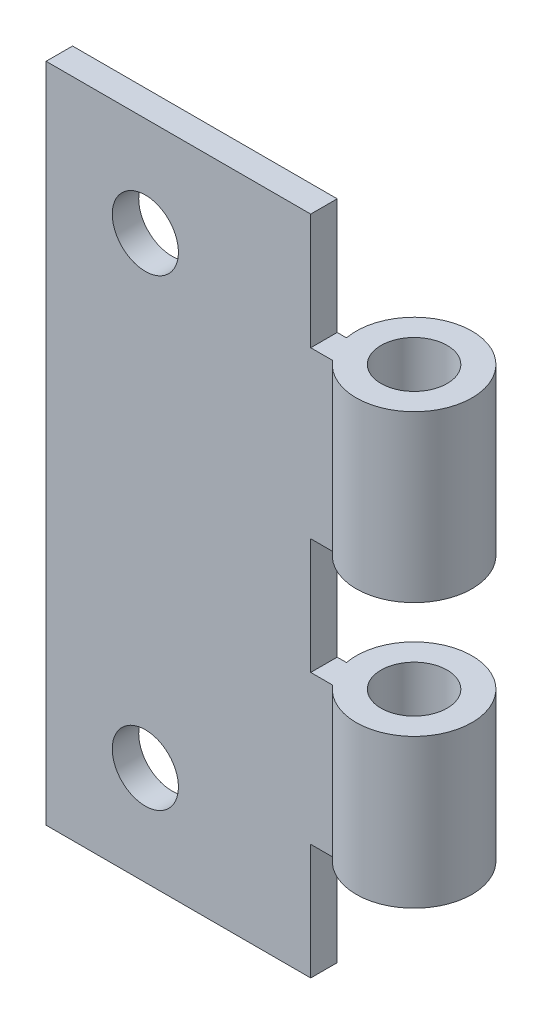
ISO-10303-21;
HEADER;
FILE_DESCRIPTION(('STEP AP214'),'2;1');
FILE_NAME('part.step','',(''),(''),'','','');
FILE_SCHEMA(('AUTOMOTIVE_DESIGN { 1 0 10303 214 1 1 1 1 }'));
ENDSEC;
DATA;
#1=APPLICATION_CONTEXT('core data for automotive mechanical design processes');
#2=APPLICATION_PROTOCOL_DEFINITION('international standard','automotive_design',2000,#1);
#3=PRODUCT_CONTEXT('',#1,'mechanical');
#4=PRODUCT('Part','Part','',(#3));
#5=PRODUCT_RELATED_PRODUCT_CATEGORY('part','',(#4));
#6=PRODUCT_DEFINITION_FORMATION('','',#4);
#7=PRODUCT_DEFINITION_CONTEXT('part definition',#1,'design');
#8=PRODUCT_DEFINITION('design','',#6,#7);
#9=PRODUCT_DEFINITION_SHAPE('','',#8);
#10=(LENGTH_UNIT() NAMED_UNIT(*) SI_UNIT(.MILLI.,.METRE.));
#11=(NAMED_UNIT(*) PLANE_ANGLE_UNIT() SI_UNIT($,.RADIAN.));
#12=(NAMED_UNIT(*) SI_UNIT($,.STERADIAN.) SOLID_ANGLE_UNIT());
#13=UNCERTAINTY_MEASURE_WITH_UNIT(LENGTH_MEASURE(1.E-05),#10,'distance_accuracy_value','');
#14=(GEOMETRIC_REPRESENTATION_CONTEXT(3) GLOBAL_UNCERTAINTY_ASSIGNED_CONTEXT((#13)) GLOBAL_UNIT_ASSIGNED_CONTEXT((#10,
#11,#12)) REPRESENTATION_CONTEXT('',''));
#15=CARTESIAN_POINT('',(0.,0.,0.));
#16=DIRECTION('',(0.,0.,1.));
#17=DIRECTION('',(1.,0.,0.));
#18=AXIS2_PLACEMENT_3D('',#15,#16,#17);
#19=CARTESIAN_POINT('',(-9.0853298966291,50.8,0.));
#20=DIRECTION('',(0.,0.,-1.));
#21=DIRECTION('',(-1.,0.,0.));
#22=AXIS2_PLACEMENT_3D('',#19,#20,#21);
#23=PLANE('',#22);
#24=CARTESIAN_POINT('',(7.62,43.18,0.));
#25=DIRECTION('',(0.,0.,-1.));
#26=DIRECTION('',(-1.,0.,0.));
#27=AXIS2_PLACEMENT_3D('',#24,#25,#26);
#28=CIRCLE('',#27,2.54000000000001);
#29=CARTESIAN_POINT('',(5.07999999999999,43.18,0.));
#30=VERTEX_POINT('',#29);
#31=EDGE_CURVE('E224',#30,#30,#28,.T.);
#32=ORIENTED_EDGE('',*,*,#31,.T.);
#33=EDGE_LOOP('',(#32));
#34=FACE_BOUND('',#33,.T.);
#35=CARTESIAN_POINT('',(7.62,7.62,0.));
#36=DIRECTION('',(0.,0.,-1.));
#37=DIRECTION('',(-1.,0.,0.));
#38=AXIS2_PLACEMENT_3D('',#35,#36,#37);
#39=CIRCLE('',#38,2.54);
#40=CARTESIAN_POINT('',(5.08,7.62,0.));
#41=VERTEX_POINT('',#40);
#42=EDGE_CURVE('E218',#41,#41,#39,.T.);
#43=ORIENTED_EDGE('',*,*,#42,.T.);
#44=EDGE_LOOP('',(#43));
#45=FACE_BOUND('',#44,.T.);
#46=DIRECTION('',(0.,1.,0.));
#47=VECTOR('',#46,1.);
#48=CARTESIAN_POINT('',(20.32,41.91,0.));
#49=LINE('',#48,#47);
#50=CARTESIAN_POINT('',(20.32,41.91,0.));
#51=VERTEX_POINT('',#50);
#52=CARTESIAN_POINT('',(20.32,50.8,0.));
#53=VERTEX_POINT('',#52);
#54=EDGE_CURVE('E161',#51,#53,#49,.T.);
#55=ORIENTED_EDGE('',*,*,#54,.T.);
#56=DIRECTION('',(1.,0.,0.));
#57=VECTOR('',#56,1.);
#58=CARTESIAN_POINT('',(-9.0853298966291,50.8,0.));
#59=LINE('',#58,#57);
#60=CARTESIAN_POINT('',(0.,50.8,0.));
#61=VERTEX_POINT('',#60);
#62=EDGE_CURVE('E228',#61,#53,#59,.T.);
#63=ORIENTED_EDGE('',*,*,#62,.F.);
#64=DIRECTION('',(0.,-1.,0.));
#65=VECTOR('',#64,1.);
#66=CARTESIAN_POINT('',(0.,50.8,0.));
#67=LINE('',#66,#65);
#68=CARTESIAN_POINT('',(0.,0.,0.));
#69=VERTEX_POINT('',#68);
#70=EDGE_CURVE('E236',#61,#69,#67,.T.);
#71=ORIENTED_EDGE('',*,*,#70,.T.);
#72=DIRECTION('',(1.,0.,0.));
#73=VECTOR('',#72,1.);
#74=CARTESIAN_POINT('',(-9.0853298966291,0.,0.));
#75=LINE('',#74,#73);
#76=CARTESIAN_POINT('',(20.32,0.,0.));
#77=VERTEX_POINT('',#76);
#78=EDGE_CURVE('E227',#69,#77,#75,.T.);
#79=ORIENTED_EDGE('',*,*,#78,.T.);
#80=DIRECTION('',(0.,-1.,0.));
#81=VECTOR('',#80,1.);
#82=CARTESIAN_POINT('',(20.32,8.89,0.));
#83=LINE('',#82,#81);
#84=CARTESIAN_POINT('',(20.32,8.89,0.));
#85=VERTEX_POINT('',#84);
#86=EDGE_CURVE('E209',#85,#77,#83,.T.);
#87=ORIENTED_EDGE('',*,*,#86,.F.);
#88=DIRECTION('',(1.,0.,0.));
#89=VECTOR('',#88,1.);
#90=CARTESIAN_POINT('',(-9.0853298966291,8.89,0.));
#91=LINE('',#90,#89);
#92=CARTESIAN_POINT('',(21.9951918189126,8.89,0.));
#93=VERTEX_POINT('',#92);
#94=EDGE_CURVE('E197',#85,#93,#91,.T.);
#95=ORIENTED_EDGE('',*,*,#94,.T.);
#96=DIRECTION('',(0.,-1.,0.));
#97=VECTOR('',#96,1.);
#98=CARTESIAN_POINT('',(21.9951918189126,50.8,0.));
#99=LINE('',#98,#97);
#100=CARTESIAN_POINT('',(21.9951918189126,20.32,0.));
#101=VERTEX_POINT('',#100);
#102=EDGE_CURVE('E41',#101,#93,#99,.T.);
#103=ORIENTED_EDGE('',*,*,#102,.F.);
#104=DIRECTION('',(1.,0.,0.));
#105=VECTOR('',#104,1.);
#106=CARTESIAN_POINT('',(-9.0853298966291,20.32,0.));
#107=LINE('',#106,#105);
#108=CARTESIAN_POINT('',(20.32,20.32,0.));
#109=VERTEX_POINT('',#108);
#110=EDGE_CURVE('E176',#109,#101,#107,.T.);
#111=ORIENTED_EDGE('',*,*,#110,.F.);
#112=DIRECTION('',(0.,-1.,0.));
#113=VECTOR('',#112,1.);
#114=CARTESIAN_POINT('',(20.32,29.21,0.));
#115=LINE('',#114,#113);
#116=CARTESIAN_POINT('',(20.32,29.21,0.));
#117=VERTEX_POINT('',#116);
#118=EDGE_CURVE('E184',#117,#109,#115,.T.);
#119=ORIENTED_EDGE('',*,*,#118,.F.);
#120=DIRECTION('',(1.,0.,0.));
#121=VECTOR('',#120,1.);
#122=CARTESIAN_POINT('',(-9.0853298966291,29.21,0.));
#123=LINE('',#122,#121);
#124=CARTESIAN_POINT('',(21.9951918189126,29.21,0.));
#125=VERTEX_POINT('',#124);
#126=EDGE_CURVE('E181',#117,#125,#123,.T.);
#127=ORIENTED_EDGE('',*,*,#126,.T.);
#128=CARTESIAN_POINT('',(21.9951918189126,41.91,0.));
#129=VERTEX_POINT('',#128);
#130=EDGE_CURVE('E11',#129,#125,#99,.T.);
#131=ORIENTED_EDGE('',*,*,#130,.F.);
#132=DIRECTION('',(1.,0.,0.));
#133=VECTOR('',#132,1.);
#134=CARTESIAN_POINT('',(-9.0853298966291,41.91,0.));
#135=LINE('',#134,#133);
#136=EDGE_CURVE('E129',#51,#129,#135,.T.);
#137=ORIENTED_EDGE('',*,*,#136,.F.);
#138=EDGE_LOOP('',(#55,#63,#71,#79,#87,#95,#103,#111,#119,#127,#131,#137));
#139=FACE_BOUND('',#138,.T.);
#140=ADVANCED_FACE('F33',(#34,#45,#139),#23,.F.);
#141=CARTESIAN_POINT('',(25.4,50.8,-2.85750000000001));
#142=DIRECTION('',(0.,-1.,0.));
#143=DIRECTION('',(0.,0.,-1.));
#144=AXIS2_PLACEMENT_3D('',#141,#142,#143);
#145=CYLINDRICAL_SURFACE('',#144,4.44499999999999);
#146=CARTESIAN_POINT('',(25.4,41.91,-2.85750000000001));
#147=DIRECTION('',(0.,1.,0.));
#148=DIRECTION('',(0.,0.,1.));
#149=AXIS2_PLACEMENT_3D('',#146,#147,#148);
#150=CIRCLE('',#149,4.44499999999999);
#151=CARTESIAN_POINT('',(21.0323261625895,41.91,-2.032));
#152=VERTEX_POINT('',#151);
#153=EDGE_CURVE('E122',#129,#152,#150,.T.);
#154=ORIENTED_EDGE('',*,*,#153,.F.);
#155=ORIENTED_EDGE('',*,*,#130,.T.);
#156=CARTESIAN_POINT('',(25.4,29.21,-2.85750000000001));
#157=DIRECTION('',(0.,1.,0.));
#158=DIRECTION('',(0.,0.,1.));
#159=AXIS2_PLACEMENT_3D('',#156,#157,#158);
#160=CIRCLE('',#159,4.44499999999999);
#161=CARTESIAN_POINT('',(21.0323261625895,29.21,-2.032));
#162=VERTEX_POINT('',#161);
#163=EDGE_CURVE('E146',#125,#162,#160,.T.);
#164=ORIENTED_EDGE('',*,*,#163,.T.);
#165=DIRECTION('',(0.,-1.,0.));
#166=VECTOR('',#165,1.);
#167=CARTESIAN_POINT('',(21.0323261625895,50.8,-2.032));
#168=LINE('',#167,#166);
#169=EDGE_CURVE('E139',#152,#162,#168,.T.);
#170=ORIENTED_EDGE('',*,*,#169,.F.);
#171=EDGE_LOOP('',(#154,#155,#164,#170));
#172=FACE_BOUND('',#171,.T.);
#173=ADVANCED_FACE('F144',(#172),#145,.T.);
#174=CARTESIAN_POINT('',(-9.0853298966291,50.8,-2.032));
#175=DIRECTION('',(0.,0.,-1.));
#176=DIRECTION('',(-1.,0.,0.));
#177=AXIS2_PLACEMENT_3D('',#174,#175,#176);
#178=PLANE('',#177);
#179=CARTESIAN_POINT('',(7.62,43.18,-2.032));
#180=DIRECTION('',(0.,0.,-1.));
#181=DIRECTION('',(-1.,0.,0.));
#182=AXIS2_PLACEMENT_3D('',#179,#180,#181);
#183=CIRCLE('',#182,2.54000000000001);
#184=CARTESIAN_POINT('',(5.07999999999999,43.18,-2.032));
#185=VERTEX_POINT('',#184);
#186=EDGE_CURVE('E221',#185,#185,#183,.T.);
#187=ORIENTED_EDGE('',*,*,#186,.F.);
#188=EDGE_LOOP('',(#187));
#189=FACE_BOUND('',#188,.T.);
#190=CARTESIAN_POINT('',(7.62,7.62,-2.032));
#191=DIRECTION('',(0.,0.,-1.));
#192=DIRECTION('',(-1.,0.,0.));
#193=AXIS2_PLACEMENT_3D('',#190,#191,#192);
#194=CIRCLE('',#193,2.54);
#195=CARTESIAN_POINT('',(5.08,7.62,-2.032));
#196=VERTEX_POINT('',#195);
#197=EDGE_CURVE('E215',#196,#196,#194,.T.);
#198=ORIENTED_EDGE('',*,*,#197,.F.);
#199=EDGE_LOOP('',(#198));
#200=FACE_BOUND('',#199,.T.);
#201=DIRECTION('',(1.,0.,0.));
#202=VECTOR('',#201,1.);
#203=CARTESIAN_POINT('',(-9.0853298966291,50.8,-2.032));
#204=LINE('',#203,#202);
#205=CARTESIAN_POINT('',(0.,50.8,-2.032));
#206=VERTEX_POINT('',#205);
#207=CARTESIAN_POINT('',(20.32,50.8,-2.032));
#208=VERTEX_POINT('',#207);
#209=EDGE_CURVE('E230',#206,#208,#204,.T.);
#210=ORIENTED_EDGE('',*,*,#209,.T.);
#211=DIRECTION('',(0.,1.,0.));
#212=VECTOR('',#211,1.);
#213=CARTESIAN_POINT('',(20.32,41.91,-2.032));
#214=LINE('',#213,#212);
#215=CARTESIAN_POINT('',(20.32,41.91,-2.032));
#216=VERTEX_POINT('',#215);
#217=EDGE_CURVE('E49',#216,#208,#214,.T.);
#218=ORIENTED_EDGE('',*,*,#217,.F.);
#219=DIRECTION('',(1.,0.,0.));
#220=VECTOR('',#219,1.);
#221=CARTESIAN_POINT('',(-9.0853298966291,41.91,-2.032));
#222=LINE('',#221,#220);
#223=EDGE_CURVE('E127',#216,#152,#222,.T.);
#224=ORIENTED_EDGE('',*,*,#223,.T.);
#225=ORIENTED_EDGE('',*,*,#169,.T.);
#226=DIRECTION('',(1.,0.,0.));
#227=VECTOR('',#226,1.);
#228=CARTESIAN_POINT('',(-9.0853298966291,29.21,-2.032));
#229=LINE('',#228,#227);
#230=CARTESIAN_POINT('',(20.32,29.21,-2.032));
#231=VERTEX_POINT('',#230);
#232=EDGE_CURVE('E175',#231,#162,#229,.T.);
#233=ORIENTED_EDGE('',*,*,#232,.F.);
#234=DIRECTION('',(0.,-1.,0.));
#235=VECTOR('',#234,1.);
#236=CARTESIAN_POINT('',(20.32,29.21,-2.032));
#237=LINE('',#236,#235);
#238=CARTESIAN_POINT('',(20.32,20.32,-2.032));
#239=VERTEX_POINT('',#238);
#240=EDGE_CURVE('E193',#231,#239,#237,.T.);
#241=ORIENTED_EDGE('',*,*,#240,.T.);
#242=DIRECTION('',(1.,0.,0.));
#243=VECTOR('',#242,1.);
#244=CARTESIAN_POINT('',(-9.0853298966291,20.32,-2.032));
#245=LINE('',#244,#243);
#246=CARTESIAN_POINT('',(21.0323261625895,20.32,-2.032));
#247=VERTEX_POINT('',#246);
#248=EDGE_CURVE('E186',#239,#247,#245,.T.);
#249=ORIENTED_EDGE('',*,*,#248,.T.);
#250=CARTESIAN_POINT('',(21.0323261625895,8.89,-2.032));
#251=VERTEX_POINT('',#250);
#252=EDGE_CURVE('E147',#247,#251,#168,.T.);
#253=ORIENTED_EDGE('',*,*,#252,.T.);
#254=DIRECTION('',(1.,0.,0.));
#255=VECTOR('',#254,1.);
#256=CARTESIAN_POINT('',(-9.0853298966291,8.89,-2.032));
#257=LINE('',#256,#255);
#258=CARTESIAN_POINT('',(20.32,8.89,-2.032));
#259=VERTEX_POINT('',#258);
#260=EDGE_CURVE('E203',#259,#251,#257,.T.);
#261=ORIENTED_EDGE('',*,*,#260,.F.);
#262=DIRECTION('',(0.,-1.,0.));
#263=VECTOR('',#262,1.);
#264=CARTESIAN_POINT('',(20.32,8.89,-2.032));
#265=LINE('',#264,#263);
#266=CARTESIAN_POINT('',(20.32,0.,-2.032));
#267=VERTEX_POINT('',#266);
#268=EDGE_CURVE('E212',#259,#267,#265,.T.);
#269=ORIENTED_EDGE('',*,*,#268,.T.);
#270=DIRECTION('',(1.,0.,0.));
#271=VECTOR('',#270,1.);
#272=CARTESIAN_POINT('',(-9.0853298966291,0.,-2.032));
#273=LINE('',#272,#271);
#274=CARTESIAN_POINT('',(0.,0.,-2.032));
#275=VERTEX_POINT('',#274);
#276=EDGE_CURVE('E239',#275,#267,#273,.T.);
#277=ORIENTED_EDGE('',*,*,#276,.F.);
#278=DIRECTION('',(0.,-1.,0.));
#279=VECTOR('',#278,1.);
#280=CARTESIAN_POINT('',(0.,50.8,-2.032));
#281=LINE('',#280,#279);
#282=EDGE_CURVE('E149',#206,#275,#281,.T.);
#283=ORIENTED_EDGE('',*,*,#282,.F.);
#284=EDGE_LOOP('',(#210,#218,#224,#225,#233,#241,#249,#253,#261,#269,#277,#283));
#285=FACE_BOUND('',#284,.T.);
#286=ADVANCED_FACE('F137',(#189,#200,#285),#178,.T.);
#287=CARTESIAN_POINT('',(-9.0853298966291,50.8,-1.60470923574486));
#288=DIRECTION('',(0.,1.,0.));
#289=DIRECTION('',(0.,0.,1.));
#290=AXIS2_PLACEMENT_3D('',#287,#288,#289);
#291=PLANE('',#290);
#292=ORIENTED_EDGE('',*,*,#62,.T.);
#293=DIRECTION('',(0.,0.,-1.));
#294=VECTOR('',#293,1.);
#295=CARTESIAN_POINT('',(20.32,50.8,-1.60470923574486));
#296=LINE('',#295,#294);
#297=EDGE_CURVE('E133',#53,#208,#296,.T.);
#298=ORIENTED_EDGE('',*,*,#297,.T.);
#299=ORIENTED_EDGE('',*,*,#209,.F.);
#300=DIRECTION('',(0.,0.,-1.));
#301=VECTOR('',#300,1.);
#302=CARTESIAN_POINT('',(0.,50.8,-1.60470923574486));
#303=LINE('',#302,#301);
#304=EDGE_CURVE('E233',#61,#206,#303,.T.);
#305=ORIENTED_EDGE('',*,*,#304,.F.);
#306=EDGE_LOOP('',(#292,#298,#299,#305));
#307=FACE_BOUND('',#306,.T.);
#308=ADVANCED_FACE('F277',(#307),#291,.T.);
#309=CARTESIAN_POINT('',(25.4,0.,-2.85750000000001));
#310=DIRECTION('',(0.,1.,0.));
#311=DIRECTION('',(0.,0.,1.));
#312=AXIS2_PLACEMENT_3D('',#309,#310,#311);
#313=CYLINDRICAL_SURFACE('',#312,2.54);
#314=CARTESIAN_POINT('',(25.4,29.21,-2.85750000000001));
#315=DIRECTION('',(0.,1.,0.));
#316=DIRECTION('',(0.,0.,1.));
#317=AXIS2_PLACEMENT_3D('',#314,#315,#316);
#318=CIRCLE('',#317,2.54);
#319=CARTESIAN_POINT('',(25.4,29.21,-0.31750000000001));
#320=VERTEX_POINT('',#319);
#321=EDGE_CURVE('E154',#320,#320,#318,.T.);
#322=ORIENTED_EDGE('',*,*,#321,.F.);
#323=EDGE_LOOP('',(#322));
#324=FACE_BOUND('',#323,.T.);
#325=CARTESIAN_POINT('',(25.4,41.91,-2.85750000000001));
#326=DIRECTION('',(0.,1.,0.));
#327=DIRECTION('',(0.,0.,1.));
#328=AXIS2_PLACEMENT_3D('',#325,#326,#327);
#329=CIRCLE('',#328,2.54);
#330=CARTESIAN_POINT('',(25.4,41.91,-0.31750000000001));
#331=VERTEX_POINT('',#330);
#332=EDGE_CURVE('E36',#331,#331,#329,.F.);
#333=ORIENTED_EDGE('',*,*,#332,.F.);
#334=EDGE_LOOP('',(#333));
#335=FACE_BOUND('',#334,.T.);
#336=ADVANCED_FACE('F279',(#324,#335),#313,.F.);
#337=CARTESIAN_POINT('',(25.4,20.32,-2.85750000000001));
#338=DIRECTION('',(0.,1.,0.));
#339=DIRECTION('',(0.,0.,1.));
#340=AXIS2_PLACEMENT_3D('',#337,#338,#339);
#341=CIRCLE('',#340,4.44499999999999);
#342=EDGE_CURVE('E57',#101,#247,#341,.T.);
#343=ORIENTED_EDGE('',*,*,#342,.F.);
#344=ORIENTED_EDGE('',*,*,#102,.T.);
#345=CARTESIAN_POINT('',(25.4,8.89,-2.85750000000001));
#346=DIRECTION('',(0.,1.,0.));
#347=DIRECTION('',(0.,0.,1.));
#348=AXIS2_PLACEMENT_3D('',#345,#346,#347);
#349=CIRCLE('',#348,4.44499999999999);
#350=EDGE_CURVE('E200',#93,#251,#349,.T.);
#351=ORIENTED_EDGE('',*,*,#350,.T.);
#352=ORIENTED_EDGE('',*,*,#252,.F.);
#353=EDGE_LOOP('',(#343,#344,#351,#352));
#354=FACE_BOUND('',#353,.T.);
#355=ADVANCED_FACE('F264',(#354),#145,.T.);
#356=CARTESIAN_POINT('',(0.,50.8,-1.60470923574486));
#357=DIRECTION('',(-1.,0.,0.));
#358=DIRECTION('',(0.,0.,1.));
#359=AXIS2_PLACEMENT_3D('',#356,#357,#358);
#360=PLANE('',#359);
#361=DIRECTION('',(0.,0.,-1.));
#362=VECTOR('',#361,1.);
#363=CARTESIAN_POINT('',(0.,0.,-1.60470923574486));
#364=LINE('',#363,#362);
#365=EDGE_CURVE('E231',#69,#275,#364,.T.);
#366=ORIENTED_EDGE('',*,*,#365,.F.);
#367=ORIENTED_EDGE('',*,*,#70,.F.);
#368=ORIENTED_EDGE('',*,*,#304,.T.);
#369=ORIENTED_EDGE('',*,*,#282,.T.);
#370=EDGE_LOOP('',(#366,#367,#368,#369));
#371=FACE_BOUND('',#370,.T.);
#372=ADVANCED_FACE('F247',(#371),#360,.T.);
#373=CARTESIAN_POINT('',(-9.0853298966291,0.,-1.60470923574486));
#374=DIRECTION('',(0.,1.,0.));
#375=DIRECTION('',(0.,0.,1.));
#376=AXIS2_PLACEMENT_3D('',#373,#374,#375);
#377=PLANE('',#376);
#378=ORIENTED_EDGE('',*,*,#276,.T.);
#379=DIRECTION('',(0.,0.,-1.));
#380=VECTOR('',#379,1.);
#381=CARTESIAN_POINT('',(20.32,0.,-1.60470923574486));
#382=LINE('',#381,#380);
#383=EDGE_CURVE('E196',#77,#267,#382,.T.);
#384=ORIENTED_EDGE('',*,*,#383,.F.);
#385=ORIENTED_EDGE('',*,*,#78,.F.);
#386=ORIENTED_EDGE('',*,*,#365,.T.);
#387=EDGE_LOOP('',(#378,#384,#385,#386));
#388=FACE_BOUND('',#387,.T.);
#389=ADVANCED_FACE('F253',(#388),#377,.F.);
#390=CARTESIAN_POINT('',(7.62,43.18,48.768));
#391=DIRECTION('',(0.,0.,-1.));
#392=DIRECTION('',(-1.,0.,0.));
#393=AXIS2_PLACEMENT_3D('',#390,#391,#392);
#394=CYLINDRICAL_SURFACE('',#393,2.54000000000001);
#395=ORIENTED_EDGE('',*,*,#186,.T.);
#396=EDGE_LOOP('',(#395));
#397=FACE_BOUND('',#396,.T.);
#398=ORIENTED_EDGE('',*,*,#31,.F.);
#399=EDGE_LOOP('',(#398));
#400=FACE_BOUND('',#399,.T.);
#401=ADVANCED_FACE('F303',(#397,#400),#394,.F.);
#402=CARTESIAN_POINT('',(7.62,7.62,48.768));
#403=DIRECTION('',(0.,0.,-1.));
#404=DIRECTION('',(-1.,0.,0.));
#405=AXIS2_PLACEMENT_3D('',#402,#403,#404);
#406=CYLINDRICAL_SURFACE('',#405,2.54);
#407=ORIENTED_EDGE('',*,*,#197,.T.);
#408=EDGE_LOOP('',(#407));
#409=FACE_BOUND('',#408,.T.);
#410=ORIENTED_EDGE('',*,*,#42,.F.);
#411=EDGE_LOOP('',(#410));
#412=FACE_BOUND('',#411,.T.);
#413=ADVANCED_FACE('F301',(#409,#412),#406,.F.);
#414=CARTESIAN_POINT('',(20.32,8.89,-1.60470923574486));
#415=DIRECTION('',(-1.,0.,0.));
#416=DIRECTION('',(0.,0.,1.));
#417=AXIS2_PLACEMENT_3D('',#414,#415,#416);
#418=PLANE('',#417);
#419=ORIENTED_EDGE('',*,*,#383,.T.);
#420=ORIENTED_EDGE('',*,*,#268,.F.);
#421=DIRECTION('',(0.,0.,-1.));
#422=VECTOR('',#421,1.);
#423=CARTESIAN_POINT('',(20.32,8.89,-1.60470923574486));
#424=LINE('',#423,#422);
#425=EDGE_CURVE('E206',#85,#259,#424,.T.);
#426=ORIENTED_EDGE('',*,*,#425,.F.);
#427=ORIENTED_EDGE('',*,*,#86,.T.);
#428=EDGE_LOOP('',(#419,#420,#426,#427));
#429=FACE_BOUND('',#428,.T.);
#430=ADVANCED_FACE('F258',(#429),#418,.F.);
#431=CARTESIAN_POINT('',(-9.0853298966291,8.89,-1.60470923574486));
#432=DIRECTION('',(0.,1.,0.));
#433=DIRECTION('',(0.,0.,1.));
#434=AXIS2_PLACEMENT_3D('',#431,#432,#433);
#435=PLANE('',#434);
#436=CARTESIAN_POINT('',(25.4,8.89,-2.85750000000001));
#437=DIRECTION('',(0.,1.,0.));
#438=DIRECTION('',(0.,0.,1.));
#439=AXIS2_PLACEMENT_3D('',#436,#437,#438);
#440=CIRCLE('',#439,2.54);
#441=CARTESIAN_POINT('',(25.4,8.89,-0.31750000000001));
#442=VERTEX_POINT('',#441);
#443=EDGE_CURVE('E158',#442,#442,#440,.T.);
#444=ORIENTED_EDGE('',*,*,#443,.T.);
#445=EDGE_LOOP('',(#444));
#446=FACE_BOUND('',#445,.T.);
#447=ORIENTED_EDGE('',*,*,#94,.F.);
#448=ORIENTED_EDGE('',*,*,#425,.T.);
#449=ORIENTED_EDGE('',*,*,#260,.T.);
#450=ORIENTED_EDGE('',*,*,#350,.F.);
#451=EDGE_LOOP('',(#447,#448,#449,#450));
#452=FACE_BOUND('',#451,.T.);
#453=ADVANCED_FACE('F260',(#446,#452),#435,.F.);
#454=CARTESIAN_POINT('',(20.32,29.21,-1.60470923574486));
#455=DIRECTION('',(-1.,0.,0.));
#456=DIRECTION('',(0.,0.,1.));
#457=AXIS2_PLACEMENT_3D('',#454,#455,#456);
#458=PLANE('',#457);
#459=DIRECTION('',(0.,0.,-1.));
#460=VECTOR('',#459,1.);
#461=CARTESIAN_POINT('',(20.32,20.32,-1.60470923574486));
#462=LINE('',#461,#460);
#463=EDGE_CURVE('E188',#109,#239,#462,.T.);
#464=ORIENTED_EDGE('',*,*,#463,.T.);
#465=ORIENTED_EDGE('',*,*,#240,.F.);
#466=DIRECTION('',(0.,0.,-1.));
#467=VECTOR('',#466,1.);
#468=CARTESIAN_POINT('',(20.32,29.21,-1.60470923574486));
#469=LINE('',#468,#467);
#470=EDGE_CURVE('E178',#117,#231,#469,.T.);
#471=ORIENTED_EDGE('',*,*,#470,.F.);
#472=ORIENTED_EDGE('',*,*,#118,.T.);
#473=EDGE_LOOP('',(#464,#465,#471,#472));
#474=FACE_BOUND('',#473,.T.);
#475=ADVANCED_FACE('F270',(#474),#458,.F.);
#476=CARTESIAN_POINT('',(-9.0853298966291,29.21,-1.60470923574486));
#477=DIRECTION('',(0.,1.,0.));
#478=DIRECTION('',(0.,0.,1.));
#479=AXIS2_PLACEMENT_3D('',#476,#477,#478);
#480=PLANE('',#479);
#481=ORIENTED_EDGE('',*,*,#321,.T.);
#482=EDGE_LOOP('',(#481));
#483=FACE_BOUND('',#482,.T.);
#484=ORIENTED_EDGE('',*,*,#163,.F.);
#485=ORIENTED_EDGE('',*,*,#126,.F.);
#486=ORIENTED_EDGE('',*,*,#470,.T.);
#487=ORIENTED_EDGE('',*,*,#232,.T.);
#488=EDGE_LOOP('',(#484,#485,#486,#487));
#489=FACE_BOUND('',#488,.T.);
#490=ADVANCED_FACE('F273',(#483,#489),#480,.F.);
#491=CARTESIAN_POINT('',(-9.0853298966291,20.32,-1.60470923574486));
#492=DIRECTION('',(0.,1.,0.));
#493=DIRECTION('',(0.,0.,1.));
#494=AXIS2_PLACEMENT_3D('',#491,#492,#493);
#495=PLANE('',#494);
#496=CARTESIAN_POINT('',(25.4,20.32,-2.85750000000001));
#497=DIRECTION('',(0.,1.,0.));
#498=DIRECTION('',(0.,0.,1.));
#499=AXIS2_PLACEMENT_3D('',#496,#497,#498);
#500=CIRCLE('',#499,2.54);
#501=CARTESIAN_POINT('',(25.4,20.32,-0.31750000000001));
#502=VERTEX_POINT('',#501);
#503=EDGE_CURVE('E152',#502,#502,#500,.T.);
#504=ORIENTED_EDGE('',*,*,#503,.F.);
#505=EDGE_LOOP('',(#504));
#506=FACE_BOUND('',#505,.T.);
#507=ORIENTED_EDGE('',*,*,#342,.T.);
#508=ORIENTED_EDGE('',*,*,#248,.F.);
#509=ORIENTED_EDGE('',*,*,#463,.F.);
#510=ORIENTED_EDGE('',*,*,#110,.T.);
#511=EDGE_LOOP('',(#507,#508,#509,#510));
#512=FACE_BOUND('',#511,.T.);
#513=ADVANCED_FACE('F268',(#506,#512),#495,.T.);
#514=ORIENTED_EDGE('',*,*,#503,.T.);
#515=EDGE_LOOP('',(#514));
#516=FACE_BOUND('',#515,.T.);
#517=ORIENTED_EDGE('',*,*,#443,.F.);
#518=EDGE_LOOP('',(#517));
#519=FACE_BOUND('',#518,.T.);
#520=ADVANCED_FACE('F287',(#516,#519),#313,.F.);
#521=CARTESIAN_POINT('',(-9.0853298966291,41.91,-1.60470923574486));
#522=DIRECTION('',(0.,1.,0.));
#523=DIRECTION('',(0.,0.,1.));
#524=AXIS2_PLACEMENT_3D('',#521,#522,#523);
#525=PLANE('',#524);
#526=ORIENTED_EDGE('',*,*,#153,.T.);
#527=ORIENTED_EDGE('',*,*,#223,.F.);
#528=DIRECTION('',(0.,0.,-1.));
#529=VECTOR('',#528,1.);
#530=CARTESIAN_POINT('',(20.32,41.91,-1.60470923574486));
#531=LINE('',#530,#529);
#532=EDGE_CURVE('E141',#51,#216,#531,.T.);
#533=ORIENTED_EDGE('',*,*,#532,.F.);
#534=ORIENTED_EDGE('',*,*,#136,.T.);
#535=EDGE_LOOP('',(#526,#527,#533,#534));
#536=FACE_BOUND('',#535,.T.);
#537=ORIENTED_EDGE('',*,*,#332,.T.);
#538=EDGE_LOOP('',(#537));
#539=FACE_BOUND('',#538,.T.);
#540=ADVANCED_FACE('F124',(#536,#539),#525,.T.);
#541=CARTESIAN_POINT('',(20.32,41.91,-1.60470923574486));
#542=DIRECTION('',(1.,0.,0.));
#543=DIRECTION('',(0.,0.,-1.));
#544=AXIS2_PLACEMENT_3D('',#541,#542,#543);
#545=PLANE('',#544);
#546=ORIENTED_EDGE('',*,*,#297,.F.);
#547=ORIENTED_EDGE('',*,*,#54,.F.);
#548=ORIENTED_EDGE('',*,*,#532,.T.);
#549=ORIENTED_EDGE('',*,*,#217,.T.);
#550=EDGE_LOOP('',(#546,#547,#548,#549));
#551=FACE_BOUND('',#550,.T.);
#552=ADVANCED_FACE('F275',(#551),#545,.T.);
#553=CLOSED_SHELL('',(#140,#173,#286,#308,#336,#355,#372,#389,#401,#413,#430,#453,#475,#490,
#513,#520,#540,#552));
#554=MANIFOLD_SOLID_BREP('B2',#553);
#555=ADVANCED_BREP_SHAPE_REPRESENTATION('',(#18,#554),#14);
#556=SHAPE_DEFINITION_REPRESENTATION(#9,#555);
ENDSEC;
END-ISO-10303-21;
